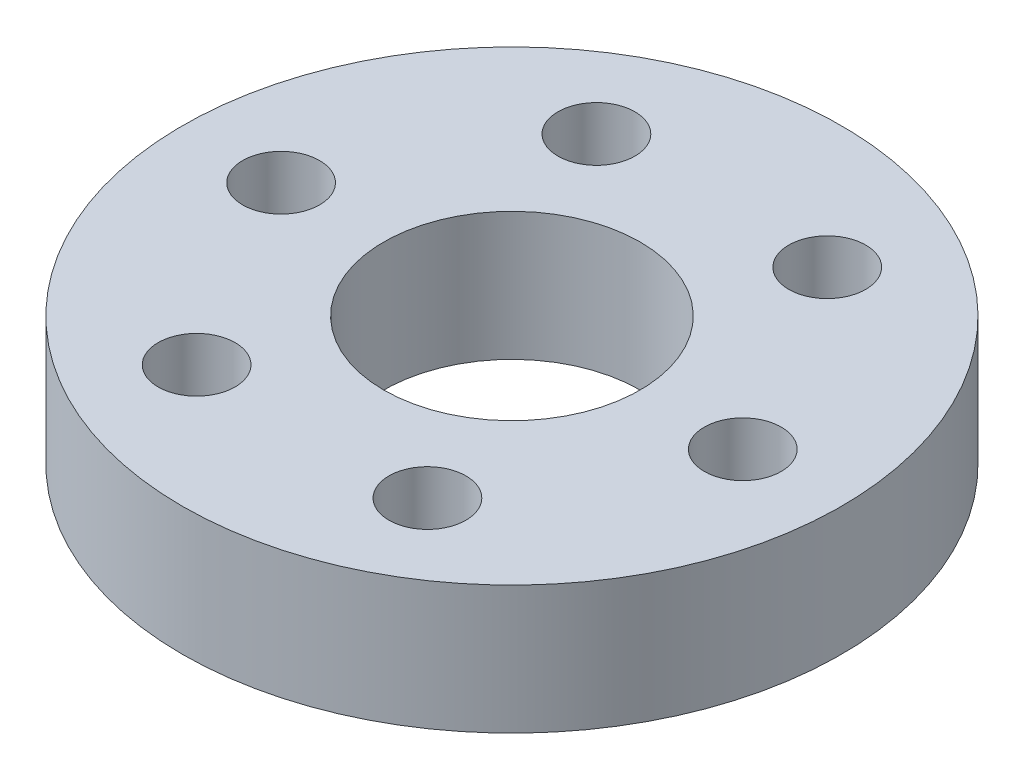
ISO-10303-21;
HEADER;
FILE_DESCRIPTION(('STEP AP214'),'2;1');
FILE_NAME('part.step','',(''),(''),'','','');
FILE_SCHEMA(('AUTOMOTIVE_DESIGN { 1 0 10303 214 1 1 1 1 }'));
ENDSEC;
DATA;
#1=APPLICATION_CONTEXT('core data for automotive mechanical design processes');
#2=APPLICATION_PROTOCOL_DEFINITION('international standard','automotive_design',2000,#1);
#3=PRODUCT_CONTEXT('',#1,'mechanical');
#4=PRODUCT('Part','Part','',(#3));
#5=PRODUCT_RELATED_PRODUCT_CATEGORY('part','',(#4));
#6=PRODUCT_DEFINITION_FORMATION('','',#4);
#7=PRODUCT_DEFINITION_CONTEXT('part definition',#1,'design');
#8=PRODUCT_DEFINITION('design','',#6,#7);
#9=PRODUCT_DEFINITION_SHAPE('','',#8);
#10=(LENGTH_UNIT() NAMED_UNIT(*) SI_UNIT(.MILLI.,.METRE.));
#11=(NAMED_UNIT(*) PLANE_ANGLE_UNIT() SI_UNIT($,.RADIAN.));
#12=(NAMED_UNIT(*) SI_UNIT($,.STERADIAN.) SOLID_ANGLE_UNIT());
#13=UNCERTAINTY_MEASURE_WITH_UNIT(LENGTH_MEASURE(1.E-05),#10,'distance_accuracy_value','');
#14=(GEOMETRIC_REPRESENTATION_CONTEXT(3) GLOBAL_UNCERTAINTY_ASSIGNED_CONTEXT((#13)) GLOBAL_UNIT_ASSIGNED_CONTEXT((#10,
#11,#12)) REPRESENTATION_CONTEXT('',''));
#15=CARTESIAN_POINT('',(0.,0.,0.));
#16=DIRECTION('',(0.,0.,1.));
#17=DIRECTION('',(1.,0.,0.));
#18=AXIS2_PLACEMENT_3D('',#15,#16,#17);
#19=CARTESIAN_POINT('',(0.,5.,0.));
#20=DIRECTION('',(0.,1.,0.));
#21=DIRECTION('',(0.,0.,1.));
#22=AXIS2_PLACEMENT_3D('',#19,#20,#21);
#23=PLANE('',#22);
#24=CARTESIAN_POINT('',(9.,5.,0.));
#25=DIRECTION('',(0.,1.,0.));
#26=DIRECTION('',(0.,0.,1.));
#27=AXIS2_PLACEMENT_3D('',#24,#25,#26);
#28=CIRCLE('',#27,1.49999999999999);
#29=CARTESIAN_POINT('',(9.,5.,1.49999999999999));
#30=VERTEX_POINT('',#29);
#31=EDGE_CURVE('E81',#30,#30,#28,.T.);
#32=ORIENTED_EDGE('',*,*,#31,.F.);
#33=EDGE_LOOP('',(#32));
#34=FACE_BOUND('',#33,.T.);
#35=CARTESIAN_POINT('',(-4.50000000000004,5.,-7.79422863405992));
#36=DIRECTION('',(0.,1.,0.));
#37=DIRECTION('',(0.,0.,1.));
#38=AXIS2_PLACEMENT_3D('',#35,#36,#37);
#39=CIRCLE('',#38,1.49999999999999);
#40=CARTESIAN_POINT('',(-4.50000000000004,5.,-6.29422863405994));
#41=VERTEX_POINT('',#40);
#42=EDGE_CURVE('E75',#41,#41,#39,.T.);
#43=ORIENTED_EDGE('',*,*,#42,.F.);
#44=EDGE_LOOP('',(#43));
#45=FACE_BOUND('',#44,.T.);
#46=CARTESIAN_POINT('',(-4.50000000000004,5.,7.79422863405993));
#47=DIRECTION('',(0.,1.,0.));
#48=DIRECTION('',(0.,0.,1.));
#49=AXIS2_PLACEMENT_3D('',#46,#47,#48);
#50=CIRCLE('',#49,1.49999999999999);
#51=CARTESIAN_POINT('',(-4.50000000000004,5.,9.29422863405991));
#52=VERTEX_POINT('',#51);
#53=EDGE_CURVE('E69',#52,#52,#50,.T.);
#54=ORIENTED_EDGE('',*,*,#53,.F.);
#55=EDGE_LOOP('',(#54));
#56=FACE_BOUND('',#55,.T.);
#57=CARTESIAN_POINT('',(4.50000000000004,5.,7.79422863405993));
#58=DIRECTION('',(0.,1.,0.));
#59=DIRECTION('',(0.,0.,1.));
#60=AXIS2_PLACEMENT_3D('',#57,#58,#59);
#61=CIRCLE('',#60,1.5);
#62=CARTESIAN_POINT('',(4.50000000000004,5.,9.29422863405993));
#63=VERTEX_POINT('',#62);
#64=EDGE_CURVE('E52',#63,#63,#61,.T.);
#65=ORIENTED_EDGE('',*,*,#64,.F.);
#66=EDGE_LOOP('',(#65));
#67=FACE_BOUND('',#66,.T.);
#68=CARTESIAN_POINT('',(4.50000000000003,5.,-7.79422863405993));
#69=DIRECTION('',(0.,1.,0.));
#70=DIRECTION('',(0.,0.,1.));
#71=AXIS2_PLACEMENT_3D('',#68,#69,#70);
#72=CIRCLE('',#71,1.5);
#73=CARTESIAN_POINT('',(4.50000000000003,5.,-6.29422863405993));
#74=VERTEX_POINT('',#73);
#75=EDGE_CURVE('E41',#74,#74,#72,.T.);
#76=ORIENTED_EDGE('',*,*,#75,.F.);
#77=EDGE_LOOP('',(#76));
#78=FACE_BOUND('',#77,.T.);
#79=CARTESIAN_POINT('',(0.,5.,0.));
#80=DIRECTION('',(0.,1.,0.));
#81=DIRECTION('',(0.,0.,1.));
#82=AXIS2_PLACEMENT_3D('',#79,#80,#81);
#83=CIRCLE('',#82,12.85);
#84=CARTESIAN_POINT('',(0.,5.,12.85));
#85=VERTEX_POINT('',#84);
#86=EDGE_CURVE('E10',#85,#85,#83,.T.);
#87=ORIENTED_EDGE('',*,*,#86,.T.);
#88=EDGE_LOOP('',(#87));
#89=FACE_BOUND('',#88,.T.);
#90=CARTESIAN_POINT('',(-9.,5.,0.));
#91=DIRECTION('',(0.,1.,0.));
#92=DIRECTION('',(0.,0.,1.));
#93=AXIS2_PLACEMENT_3D('',#90,#91,#92);
#94=CIRCLE('',#93,1.5);
#95=CARTESIAN_POINT('',(-9.,5.,1.5));
#96=VERTEX_POINT('',#95);
#97=EDGE_CURVE('E46',#96,#96,#94,.T.);
#98=ORIENTED_EDGE('',*,*,#97,.F.);
#99=EDGE_LOOP('',(#98));
#100=FACE_BOUND('',#99,.T.);
#101=CARTESIAN_POINT('',(0.,5.,0.));
#102=DIRECTION('',(0.,1.,0.));
#103=DIRECTION('',(0.,0.,1.));
#104=AXIS2_PLACEMENT_3D('',#101,#102,#103);
#105=CIRCLE('',#104,5.);
#106=CARTESIAN_POINT('',(0.,5.,5.));
#107=VERTEX_POINT('',#106);
#108=EDGE_CURVE('E58',#107,#107,#105,.T.);
#109=ORIENTED_EDGE('',*,*,#108,.F.);
#110=EDGE_LOOP('',(#109));
#111=FACE_BOUND('',#110,.T.);
#112=ADVANCED_FACE('F30',(#34,#45,#56,#67,#78,#89,#100,#111),#23,.T.);
#113=CARTESIAN_POINT('',(0.,0.,0.));
#114=DIRECTION('',(0.,1.,0.));
#115=DIRECTION('',(0.,0.,1.));
#116=AXIS2_PLACEMENT_3D('',#113,#114,#115);
#117=PLANE('',#116);
#118=CARTESIAN_POINT('',(9.,0.,0.));
#119=DIRECTION('',(0.,1.,0.));
#120=DIRECTION('',(0.,0.,1.));
#121=AXIS2_PLACEMENT_3D('',#118,#119,#120);
#122=CIRCLE('',#121,1.49999999999999);
#123=CARTESIAN_POINT('',(9.,0.,1.49999999999999));
#124=VERTEX_POINT('',#123);
#125=EDGE_CURVE('E78',#124,#124,#122,.T.);
#126=ORIENTED_EDGE('',*,*,#125,.T.);
#127=EDGE_LOOP('',(#126));
#128=FACE_BOUND('',#127,.T.);
#129=CARTESIAN_POINT('',(-4.50000000000004,0.,-7.79422863405992));
#130=DIRECTION('',(0.,1.,0.));
#131=DIRECTION('',(0.,0.,1.));
#132=AXIS2_PLACEMENT_3D('',#129,#130,#131);
#133=CIRCLE('',#132,1.49999999999999);
#134=CARTESIAN_POINT('',(-4.50000000000004,0.,-6.29422863405993));
#135=VERTEX_POINT('',#134);
#136=EDGE_CURVE('E72',#135,#135,#133,.T.);
#137=ORIENTED_EDGE('',*,*,#136,.T.);
#138=EDGE_LOOP('',(#137));
#139=FACE_BOUND('',#138,.T.);
#140=CARTESIAN_POINT('',(-4.50000000000004,0.,7.79422863405993));
#141=DIRECTION('',(0.,1.,0.));
#142=DIRECTION('',(0.,0.,1.));
#143=AXIS2_PLACEMENT_3D('',#140,#141,#142);
#144=CIRCLE('',#143,1.49999999999999);
#145=CARTESIAN_POINT('',(-4.50000000000004,0.,9.29422863405992));
#146=VERTEX_POINT('',#145);
#147=EDGE_CURVE('E64',#146,#146,#144,.T.);
#148=ORIENTED_EDGE('',*,*,#147,.T.);
#149=EDGE_LOOP('',(#148));
#150=FACE_BOUND('',#149,.T.);
#151=CARTESIAN_POINT('',(4.50000000000004,0.,7.79422863405993));
#152=DIRECTION('',(0.,1.,0.));
#153=DIRECTION('',(0.,0.,1.));
#154=AXIS2_PLACEMENT_3D('',#151,#152,#153);
#155=CIRCLE('',#154,1.5);
#156=CARTESIAN_POINT('',(4.50000000000004,0.,9.29422863405993));
#157=VERTEX_POINT('',#156);
#158=EDGE_CURVE('E55',#157,#157,#155,.T.);
#159=ORIENTED_EDGE('',*,*,#158,.T.);
#160=EDGE_LOOP('',(#159));
#161=FACE_BOUND('',#160,.T.);
#162=CARTESIAN_POINT('',(4.50000000000003,0.,-7.79422863405993));
#163=DIRECTION('',(0.,1.,0.));
#164=DIRECTION('',(0.,0.,1.));
#165=AXIS2_PLACEMENT_3D('',#162,#163,#164);
#166=CIRCLE('',#165,1.5);
#167=CARTESIAN_POINT('',(4.50000000000003,0.,-6.29422863405993));
#168=VERTEX_POINT('',#167);
#169=EDGE_CURVE('E43',#168,#168,#166,.T.);
#170=ORIENTED_EDGE('',*,*,#169,.T.);
#171=EDGE_LOOP('',(#170));
#172=FACE_BOUND('',#171,.T.);
#173=CARTESIAN_POINT('',(0.,0.,0.));
#174=DIRECTION('',(0.,1.,0.));
#175=DIRECTION('',(0.,0.,1.));
#176=AXIS2_PLACEMENT_3D('',#173,#174,#175);
#177=CIRCLE('',#176,12.85);
#178=CARTESIAN_POINT('',(0.,0.,12.85));
#179=VERTEX_POINT('',#178);
#180=EDGE_CURVE('E34',#179,#179,#177,.T.);
#181=ORIENTED_EDGE('',*,*,#180,.F.);
#182=EDGE_LOOP('',(#181));
#183=FACE_BOUND('',#182,.T.);
#184=CARTESIAN_POINT('',(-9.,0.,0.));
#185=DIRECTION('',(0.,1.,0.));
#186=DIRECTION('',(0.,0.,1.));
#187=AXIS2_PLACEMENT_3D('',#184,#185,#186);
#188=CIRCLE('',#187,1.5);
#189=CARTESIAN_POINT('',(-9.,0.,1.5));
#190=VERTEX_POINT('',#189);
#191=EDGE_CURVE('E49',#190,#190,#188,.T.);
#192=ORIENTED_EDGE('',*,*,#191,.T.);
#193=EDGE_LOOP('',(#192));
#194=FACE_BOUND('',#193,.T.);
#195=CARTESIAN_POINT('',(0.,0.,0.));
#196=DIRECTION('',(0.,1.,0.));
#197=DIRECTION('',(0.,0.,1.));
#198=AXIS2_PLACEMENT_3D('',#195,#196,#197);
#199=CIRCLE('',#198,5.);
#200=CARTESIAN_POINT('',(0.,0.,5.));
#201=VERTEX_POINT('',#200);
#202=EDGE_CURVE('E61',#201,#201,#199,.T.);
#203=ORIENTED_EDGE('',*,*,#202,.T.);
#204=EDGE_LOOP('',(#203));
#205=FACE_BOUND('',#204,.T.);
#206=ADVANCED_FACE('F89',(#128,#139,#150,#161,#172,#183,#194,#205),#117,.F.);
#207=CARTESIAN_POINT('',(0.,5.,0.));
#208=DIRECTION('',(0.,-1.,0.));
#209=DIRECTION('',(0.,0.,-1.));
#210=AXIS2_PLACEMENT_3D('',#207,#208,#209);
#211=CYLINDRICAL_SURFACE('',#210,12.85);
#212=ORIENTED_EDGE('',*,*,#86,.F.);
#213=EDGE_LOOP('',(#212));
#214=FACE_BOUND('',#213,.T.);
#215=ORIENTED_EDGE('',*,*,#180,.T.);
#216=EDGE_LOOP('',(#215));
#217=FACE_BOUND('',#216,.T.);
#218=ADVANCED_FACE('F32',(#214,#217),#211,.T.);
#219=CARTESIAN_POINT('',(4.50000000000003,5.,-7.79422863405993));
#220=DIRECTION('',(0.,-1.,0.));
#221=DIRECTION('',(0.,0.,-1.));
#222=AXIS2_PLACEMENT_3D('',#219,#220,#221);
#223=CYLINDRICAL_SURFACE('',#222,1.5);
#224=ORIENTED_EDGE('',*,*,#75,.T.);
#225=EDGE_LOOP('',(#224));
#226=FACE_BOUND('',#225,.T.);
#227=ORIENTED_EDGE('',*,*,#169,.F.);
#228=EDGE_LOOP('',(#227));
#229=FACE_BOUND('',#228,.T.);
#230=ADVANCED_FACE('F116',(#226,#229),#223,.F.);
#231=CARTESIAN_POINT('',(-9.,5.,0.));
#232=DIRECTION('',(0.,-1.,0.));
#233=DIRECTION('',(0.,0.,-1.));
#234=AXIS2_PLACEMENT_3D('',#231,#232,#233);
#235=CYLINDRICAL_SURFACE('',#234,1.5);
#236=ORIENTED_EDGE('',*,*,#97,.T.);
#237=EDGE_LOOP('',(#236));
#238=FACE_BOUND('',#237,.T.);
#239=ORIENTED_EDGE('',*,*,#191,.F.);
#240=EDGE_LOOP('',(#239));
#241=FACE_BOUND('',#240,.T.);
#242=ADVANCED_FACE('F122',(#238,#241),#235,.F.);
#243=CARTESIAN_POINT('',(4.50000000000004,5.,7.79422863405993));
#244=DIRECTION('',(0.,-1.,0.));
#245=DIRECTION('',(0.,0.,-1.));
#246=AXIS2_PLACEMENT_3D('',#243,#244,#245);
#247=CYLINDRICAL_SURFACE('',#246,1.5);
#248=ORIENTED_EDGE('',*,*,#64,.T.);
#249=EDGE_LOOP('',(#248));
#250=FACE_BOUND('',#249,.T.);
#251=ORIENTED_EDGE('',*,*,#158,.F.);
#252=EDGE_LOOP('',(#251));
#253=FACE_BOUND('',#252,.T.);
#254=ADVANCED_FACE('F107',(#250,#253),#247,.F.);
#255=CARTESIAN_POINT('',(0.,5.,0.));
#256=DIRECTION('',(0.,-1.,0.));
#257=DIRECTION('',(0.,0.,-1.));
#258=AXIS2_PLACEMENT_3D('',#255,#256,#257);
#259=CYLINDRICAL_SURFACE('',#258,5.);
#260=ORIENTED_EDGE('',*,*,#108,.T.);
#261=EDGE_LOOP('',(#260));
#262=FACE_BOUND('',#261,.T.);
#263=ORIENTED_EDGE('',*,*,#202,.F.);
#264=EDGE_LOOP('',(#263));
#265=FACE_BOUND('',#264,.T.);
#266=ADVANCED_FACE('F103',(#262,#265),#259,.F.);
#267=CARTESIAN_POINT('',(-4.50000000000004,5.,7.79422863405993));
#268=DIRECTION('',(0.,1.,0.));
#269=DIRECTION('',(0.,0.,1.));
#270=AXIS2_PLACEMENT_3D('',#267,#268,#269);
#271=CYLINDRICAL_SURFACE('',#270,1.49999999999999);
#272=ORIENTED_EDGE('',*,*,#147,.F.);
#273=EDGE_LOOP('',(#272));
#274=FACE_BOUND('',#273,.T.);
#275=ORIENTED_EDGE('',*,*,#53,.T.);
#276=EDGE_LOOP('',(#275));
#277=FACE_BOUND('',#276,.T.);
#278=ADVANCED_FACE('F106',(#274,#277),#271,.F.);
#279=CARTESIAN_POINT('',(-4.50000000000004,5.,-7.79422863405992));
#280=DIRECTION('',(0.,1.,0.));
#281=DIRECTION('',(0.,0.,1.));
#282=AXIS2_PLACEMENT_3D('',#279,#280,#281);
#283=CYLINDRICAL_SURFACE('',#282,1.49999999999999);
#284=ORIENTED_EDGE('',*,*,#136,.F.);
#285=EDGE_LOOP('',(#284));
#286=FACE_BOUND('',#285,.T.);
#287=ORIENTED_EDGE('',*,*,#42,.T.);
#288=EDGE_LOOP('',(#287));
#289=FACE_BOUND('',#288,.T.);
#290=ADVANCED_FACE('F132',(#286,#289),#283,.F.);
#291=CARTESIAN_POINT('',(9.,5.,0.));
#292=DIRECTION('',(0.,1.,0.));
#293=DIRECTION('',(0.,0.,1.));
#294=AXIS2_PLACEMENT_3D('',#291,#292,#293);
#295=CYLINDRICAL_SURFACE('',#294,1.49999999999999);
#296=ORIENTED_EDGE('',*,*,#125,.F.);
#297=EDGE_LOOP('',(#296));
#298=FACE_BOUND('',#297,.T.);
#299=ORIENTED_EDGE('',*,*,#31,.T.);
#300=EDGE_LOOP('',(#299));
#301=FACE_BOUND('',#300,.T.);
#302=ADVANCED_FACE('F85',(#298,#301),#295,.F.);
#303=CLOSED_SHELL('',(#112,#206,#218,#230,#242,#254,#266,#278,#290,#302));
#304=MANIFOLD_SOLID_BREP('B2',#303);
#305=ADVANCED_BREP_SHAPE_REPRESENTATION('',(#18,#304),#14);
#306=SHAPE_DEFINITION_REPRESENTATION(#9,#305);
ENDSEC;
END-ISO-10303-21;
